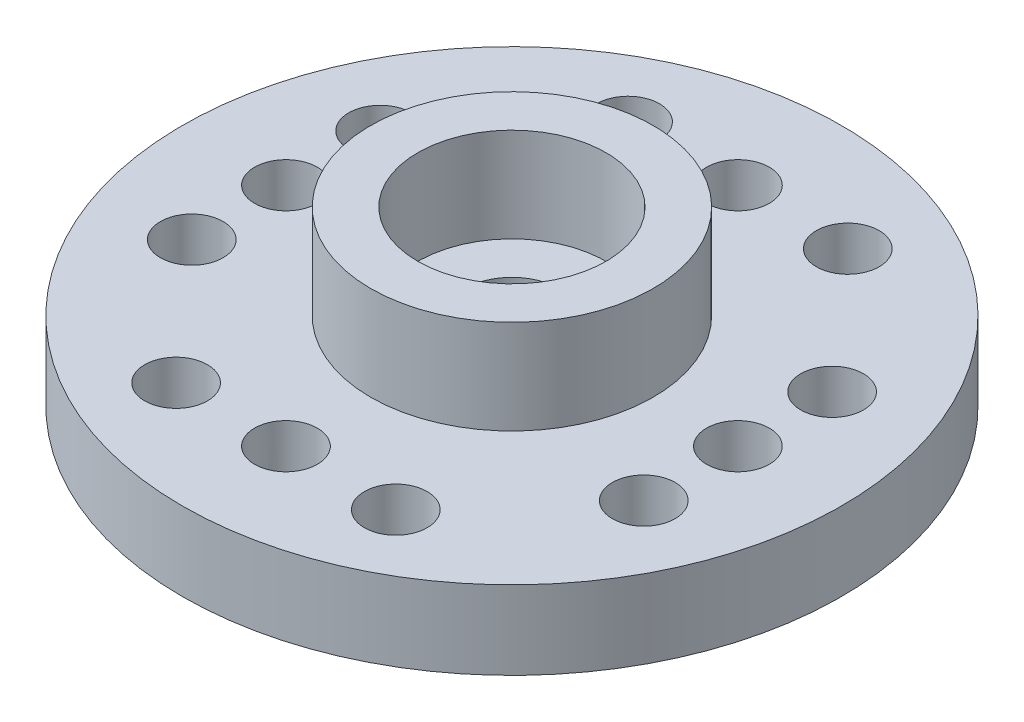
ISO-10303-21;
HEADER;
FILE_DESCRIPTION(('STEP AP214'),'2;1');
FILE_NAME('part.step','',(''),(''),'','','');
FILE_SCHEMA(('AUTOMOTIVE_DESIGN { 1 0 10303 214 1 1 1 1 }'));
ENDSEC;
DATA;
#1=APPLICATION_CONTEXT('core data for automotive mechanical design processes');
#2=APPLICATION_PROTOCOL_DEFINITION('international standard','automotive_design',2000,#1);
#3=PRODUCT_CONTEXT('',#1,'mechanical');
#4=PRODUCT('Part','Part','',(#3));
#5=PRODUCT_RELATED_PRODUCT_CATEGORY('part','',(#4));
#6=PRODUCT_DEFINITION_FORMATION('','',#4);
#7=PRODUCT_DEFINITION_CONTEXT('part definition',#1,'design');
#8=PRODUCT_DEFINITION('design','',#6,#7);
#9=PRODUCT_DEFINITION_SHAPE('','',#8);
#10=(LENGTH_UNIT() NAMED_UNIT(*) SI_UNIT(.MILLI.,.METRE.));
#11=(NAMED_UNIT(*) PLANE_ANGLE_UNIT() SI_UNIT($,.RADIAN.));
#12=(NAMED_UNIT(*) SI_UNIT($,.STERADIAN.) SOLID_ANGLE_UNIT());
#13=UNCERTAINTY_MEASURE_WITH_UNIT(LENGTH_MEASURE(1.E-05),#10,'distance_accuracy_value','');
#14=(GEOMETRIC_REPRESENTATION_CONTEXT(3) GLOBAL_UNCERTAINTY_ASSIGNED_CONTEXT((#13)) GLOBAL_UNIT_ASSIGNED_CONTEXT((#10,
#11,#12)) REPRESENTATION_CONTEXT('',''));
#15=CARTESIAN_POINT('',(0.,0.,0.));
#16=DIRECTION('',(0.,0.,1.));
#17=DIRECTION('',(1.,0.,0.));
#18=AXIS2_PLACEMENT_3D('',#15,#16,#17);
#19=CARTESIAN_POINT('',(0.,2.5,0.));
#20=DIRECTION('',(0.,-1.,0.));
#21=DIRECTION('',(0.,0.,-1.));
#22=AXIS2_PLACEMENT_3D('',#19,#20,#21);
#23=CYLINDRICAL_SURFACE('',#22,10.5);
#24=CARTESIAN_POINT('',(0.,2.5,0.));
#25=DIRECTION('',(0.,1.,0.));
#26=DIRECTION('',(0.,0.,1.));
#27=AXIS2_PLACEMENT_3D('',#24,#25,#26);
#28=CIRCLE('',#27,10.5);
#29=CARTESIAN_POINT('',(0.,2.5,10.5));
#30=VERTEX_POINT('',#29);
#31=EDGE_CURVE('E42',#30,#30,#28,.T.);
#32=ORIENTED_EDGE('',*,*,#31,.F.);
#33=EDGE_LOOP('',(#32));
#34=FACE_BOUND('',#33,.T.);
#35=CARTESIAN_POINT('',(0.,0.,0.));
#36=DIRECTION('',(0.,1.,0.));
#37=DIRECTION('',(0.,0.,1.));
#38=AXIS2_PLACEMENT_3D('',#35,#36,#37);
#39=CIRCLE('',#38,10.5);
#40=CARTESIAN_POINT('',(0.,0.,10.5));
#41=VERTEX_POINT('',#40);
#42=EDGE_CURVE('E46',#41,#41,#39,.T.);
#43=ORIENTED_EDGE('',*,*,#42,.T.);
#44=EDGE_LOOP('',(#43));
#45=FACE_BOUND('',#44,.T.);
#46=ADVANCED_FACE('F35',(#34,#45),#23,.T.);
#47=CARTESIAN_POINT('',(0.,2.5,0.));
#48=DIRECTION('',(0.,1.,0.));
#49=DIRECTION('',(0.,0.,1.));
#50=AXIS2_PLACEMENT_3D('',#47,#48,#49);
#51=PLANE('',#50);
#52=CARTESIAN_POINT('',(-3.5,2.5,7.2));
#53=DIRECTION('',(0.,1.,0.));
#54=DIRECTION('',(0.,0.,1.));
#55=AXIS2_PLACEMENT_3D('',#52,#53,#54);
#56=CIRCLE('',#55,1.);
#57=CARTESIAN_POINT('',(-3.5,2.5,8.2));
#58=VERTEX_POINT('',#57);
#59=EDGE_CURVE('E81',#58,#58,#56,.T.);
#60=ORIENTED_EDGE('',*,*,#59,.F.);
#61=EDGE_LOOP('',(#60));
#62=FACE_BOUND('',#61,.T.);
#63=CARTESIAN_POINT('',(3.5,2.5,-7.2));
#64=DIRECTION('',(0.,1.,0.));
#65=DIRECTION('',(0.,0.,1.));
#66=AXIS2_PLACEMENT_3D('',#63,#64,#65);
#67=CIRCLE('',#66,1.);
#68=CARTESIAN_POINT('',(3.5,2.5,-6.2));
#69=VERTEX_POINT('',#68);
#70=EDGE_CURVE('E84',#69,#69,#67,.T.);
#71=ORIENTED_EDGE('',*,*,#70,.F.);
#72=EDGE_LOOP('',(#71));
#73=FACE_BOUND('',#72,.T.);
#74=CARTESIAN_POINT('',(-3.5,2.5,-7.2));
#75=DIRECTION('',(0.,1.,0.));
#76=DIRECTION('',(0.,0.,1.));
#77=AXIS2_PLACEMENT_3D('',#74,#75,#76);
#78=CIRCLE('',#77,1.);
#79=CARTESIAN_POINT('',(-3.5,2.5,-6.2));
#80=VERTEX_POINT('',#79);
#81=EDGE_CURVE('E87',#80,#80,#78,.T.);
#82=ORIENTED_EDGE('',*,*,#81,.F.);
#83=EDGE_LOOP('',(#82));
#84=FACE_BOUND('',#83,.T.);
#85=CARTESIAN_POINT('',(7.2,2.5,3.));
#86=DIRECTION('',(0.,1.,0.));
#87=DIRECTION('',(0.,0.,1.));
#88=AXIS2_PLACEMENT_3D('',#85,#86,#87);
#89=CIRCLE('',#88,1.);
#90=CARTESIAN_POINT('',(7.2,2.5,4.));
#91=VERTEX_POINT('',#90);
#92=EDGE_CURVE('E90',#91,#91,#89,.T.);
#93=ORIENTED_EDGE('',*,*,#92,.F.);
#94=EDGE_LOOP('',(#93));
#95=FACE_BOUND('',#94,.T.);
#96=CARTESIAN_POINT('',(0.,2.5,-7.2));
#97=DIRECTION('',(0.,1.,0.));
#98=DIRECTION('',(0.,0.,1.));
#99=AXIS2_PLACEMENT_3D('',#96,#97,#98);
#100=CIRCLE('',#99,1.);
#101=CARTESIAN_POINT('',(0.,2.5,-6.2));
#102=VERTEX_POINT('',#101);
#103=EDGE_CURVE('E93',#102,#102,#100,.T.);
#104=ORIENTED_EDGE('',*,*,#103,.F.);
#105=EDGE_LOOP('',(#104));
#106=FACE_BOUND('',#105,.T.);
#107=CARTESIAN_POINT('',(7.2,2.5,0.));
#108=DIRECTION('',(0.,1.,0.));
#109=DIRECTION('',(0.,0.,1.));
#110=AXIS2_PLACEMENT_3D('',#107,#108,#109);
#111=CIRCLE('',#110,1.);
#112=CARTESIAN_POINT('',(7.2,2.5,1.));
#113=VERTEX_POINT('',#112);
#114=EDGE_CURVE('E96',#113,#113,#111,.T.);
#115=ORIENTED_EDGE('',*,*,#114,.F.);
#116=EDGE_LOOP('',(#115));
#117=FACE_BOUND('',#116,.T.);
#118=CARTESIAN_POINT('',(-7.2,2.5,0.));
#119=DIRECTION('',(0.,1.,0.));
#120=DIRECTION('',(0.,0.,1.));
#121=AXIS2_PLACEMENT_3D('',#118,#119,#120);
#122=CIRCLE('',#121,1.);
#123=CARTESIAN_POINT('',(-7.2,2.5,1.));
#124=VERTEX_POINT('',#123);
#125=EDGE_CURVE('E99',#124,#124,#122,.T.);
#126=ORIENTED_EDGE('',*,*,#125,.F.);
#127=EDGE_LOOP('',(#126));
#128=FACE_BOUND('',#127,.T.);
#129=CARTESIAN_POINT('',(3.5,2.5,7.2));
#130=DIRECTION('',(0.,1.,0.));
#131=DIRECTION('',(0.,0.,1.));
#132=AXIS2_PLACEMENT_3D('',#129,#130,#131);
#133=CIRCLE('',#132,1.);
#134=CARTESIAN_POINT('',(3.5,2.5,8.2));
#135=VERTEX_POINT('',#134);
#136=EDGE_CURVE('E102',#135,#135,#133,.T.);
#137=ORIENTED_EDGE('',*,*,#136,.F.);
#138=EDGE_LOOP('',(#137));
#139=FACE_BOUND('',#138,.T.);
#140=CARTESIAN_POINT('',(7.2,2.5,-3.));
#141=DIRECTION('',(0.,1.,0.));
#142=DIRECTION('',(0.,0.,1.));
#143=AXIS2_PLACEMENT_3D('',#140,#141,#142);
#144=CIRCLE('',#143,1.);
#145=CARTESIAN_POINT('',(7.2,2.5,-2.));
#146=VERTEX_POINT('',#145);
#147=EDGE_CURVE('E105',#146,#146,#144,.T.);
#148=ORIENTED_EDGE('',*,*,#147,.F.);
#149=EDGE_LOOP('',(#148));
#150=FACE_BOUND('',#149,.T.);
#151=CARTESIAN_POINT('',(-7.2,2.5,-3.));
#152=DIRECTION('',(0.,1.,0.));
#153=DIRECTION('',(0.,0.,1.));
#154=AXIS2_PLACEMENT_3D('',#151,#152,#153);
#155=CIRCLE('',#154,1.);
#156=CARTESIAN_POINT('',(-7.2,2.5,-2.));
#157=VERTEX_POINT('',#156);
#158=EDGE_CURVE('E108',#157,#157,#155,.T.);
#159=ORIENTED_EDGE('',*,*,#158,.F.);
#160=EDGE_LOOP('',(#159));
#161=FACE_BOUND('',#160,.T.);
#162=CARTESIAN_POINT('',(-7.2,2.5,3.));
#163=DIRECTION('',(0.,1.,0.));
#164=DIRECTION('',(0.,0.,1.));
#165=AXIS2_PLACEMENT_3D('',#162,#163,#164);
#166=CIRCLE('',#165,1.);
#167=CARTESIAN_POINT('',(-7.2,2.5,4.));
#168=VERTEX_POINT('',#167);
#169=EDGE_CURVE('E111',#168,#168,#166,.T.);
#170=ORIENTED_EDGE('',*,*,#169,.F.);
#171=EDGE_LOOP('',(#170));
#172=FACE_BOUND('',#171,.T.);
#173=CARTESIAN_POINT('',(0.,2.5,7.2));
#174=DIRECTION('',(0.,1.,0.));
#175=DIRECTION('',(0.,0.,1.));
#176=AXIS2_PLACEMENT_3D('',#173,#174,#175);
#177=CIRCLE('',#176,1.);
#178=CARTESIAN_POINT('',(0.,2.5,8.2));
#179=VERTEX_POINT('',#178);
#180=EDGE_CURVE('E114',#179,#179,#177,.T.);
#181=ORIENTED_EDGE('',*,*,#180,.F.);
#182=EDGE_LOOP('',(#181));
#183=FACE_BOUND('',#182,.T.);
#184=CARTESIAN_POINT('',(0.,2.5,0.));
#185=DIRECTION('',(0.,1.,0.));
#186=DIRECTION('',(0.,0.,1.));
#187=AXIS2_PLACEMENT_3D('',#184,#185,#186);
#188=CIRCLE('',#187,4.5);
#189=CARTESIAN_POINT('',(0.,2.5,4.5));
#190=VERTEX_POINT('',#189);
#191=EDGE_CURVE('E52',#190,#190,#188,.T.);
#192=ORIENTED_EDGE('',*,*,#191,.F.);
#193=EDGE_LOOP('',(#192));
#194=FACE_BOUND('',#193,.T.);
#195=ORIENTED_EDGE('',*,*,#31,.T.);
#196=EDGE_LOOP('',(#195));
#197=FACE_BOUND('',#196,.T.);
#198=ADVANCED_FACE('F160',(#62,#73,#84,#95,#106,#117,#128,#139,#150,#161,#172,#183,#194,#197),
#51,.T.);
#199=CARTESIAN_POINT('',(0.,0.,0.));
#200=DIRECTION('',(0.,1.,0.));
#201=DIRECTION('',(0.,0.,1.));
#202=AXIS2_PLACEMENT_3D('',#199,#200,#201);
#203=PLANE('',#202);
#204=CARTESIAN_POINT('',(-3.5,0.,7.2));
#205=DIRECTION('',(0.,-1.,0.));
#206=DIRECTION('',(0.,0.,-1.));
#207=AXIS2_PLACEMENT_3D('',#204,#205,#206);
#208=CIRCLE('',#207,1.);
#209=CARTESIAN_POINT('',(-3.5,0.,6.2));
#210=VERTEX_POINT('',#209);
#211=EDGE_CURVE('E130',#210,#210,#208,.T.);
#212=ORIENTED_EDGE('',*,*,#211,.F.);
#213=EDGE_LOOP('',(#212));
#214=FACE_BOUND('',#213,.T.);
#215=CARTESIAN_POINT('',(3.5,0.,-7.2));
#216=DIRECTION('',(0.,-1.,0.));
#217=DIRECTION('',(0.,0.,1.));
#218=AXIS2_PLACEMENT_3D('',#215,#216,#217);
#219=CIRCLE('',#218,1.);
#220=CARTESIAN_POINT('',(3.5,0.,-6.2));
#221=VERTEX_POINT('',#220);
#222=EDGE_CURVE('E133',#221,#221,#219,.T.);
#223=ORIENTED_EDGE('',*,*,#222,.F.);
#224=EDGE_LOOP('',(#223));
#225=FACE_BOUND('',#224,.T.);
#226=CARTESIAN_POINT('',(-3.5,0.,-7.2));
#227=DIRECTION('',(0.,-1.,0.));
#228=DIRECTION('',(0.,0.,1.));
#229=AXIS2_PLACEMENT_3D('',#226,#227,#228);
#230=CIRCLE('',#229,1.);
#231=CARTESIAN_POINT('',(-3.5,0.,-6.2));
#232=VERTEX_POINT('',#231);
#233=EDGE_CURVE('E136',#232,#232,#230,.T.);
#234=ORIENTED_EDGE('',*,*,#233,.F.);
#235=EDGE_LOOP('',(#234));
#236=FACE_BOUND('',#235,.T.);
#237=CARTESIAN_POINT('',(7.2,0.,3.));
#238=DIRECTION('',(0.,-1.,0.));
#239=DIRECTION('',(0.,0.,-1.));
#240=AXIS2_PLACEMENT_3D('',#237,#238,#239);
#241=CIRCLE('',#240,1.);
#242=CARTESIAN_POINT('',(7.2,0.,2.));
#243=VERTEX_POINT('',#242);
#244=EDGE_CURVE('E139',#243,#243,#241,.T.);
#245=ORIENTED_EDGE('',*,*,#244,.F.);
#246=EDGE_LOOP('',(#245));
#247=FACE_BOUND('',#246,.T.);
#248=CARTESIAN_POINT('',(0.,0.,-7.2));
#249=DIRECTION('',(0.,-1.,0.));
#250=DIRECTION('',(0.,0.,1.));
#251=AXIS2_PLACEMENT_3D('',#248,#249,#250);
#252=CIRCLE('',#251,1.);
#253=CARTESIAN_POINT('',(0.,0.,-6.2));
#254=VERTEX_POINT('',#253);
#255=EDGE_CURVE('E120',#254,#254,#252,.T.);
#256=ORIENTED_EDGE('',*,*,#255,.F.);
#257=EDGE_LOOP('',(#256));
#258=FACE_BOUND('',#257,.T.);
#259=CARTESIAN_POINT('',(7.2,0.,0.));
#260=DIRECTION('',(0.,-1.,0.));
#261=DIRECTION('',(0.,0.,-1.));
#262=AXIS2_PLACEMENT_3D('',#259,#260,#261);
#263=CIRCLE('',#262,1.);
#264=CARTESIAN_POINT('',(7.2,0.,-1.));
#265=VERTEX_POINT('',#264);
#266=EDGE_CURVE('E121',#265,#265,#263,.T.);
#267=ORIENTED_EDGE('',*,*,#266,.F.);
#268=EDGE_LOOP('',(#267));
#269=FACE_BOUND('',#268,.T.);
#270=CARTESIAN_POINT('',(-7.2,0.,0.));
#271=DIRECTION('',(0.,-1.,0.));
#272=DIRECTION('',(0.,0.,1.));
#273=AXIS2_PLACEMENT_3D('',#270,#271,#272);
#274=CIRCLE('',#273,1.);
#275=CARTESIAN_POINT('',(-7.2,0.,1.));
#276=VERTEX_POINT('',#275);
#277=EDGE_CURVE('E124',#276,#276,#274,.T.);
#278=ORIENTED_EDGE('',*,*,#277,.F.);
#279=EDGE_LOOP('',(#278));
#280=FACE_BOUND('',#279,.T.);
#281=CARTESIAN_POINT('',(3.5,0.,7.2));
#282=DIRECTION('',(0.,-1.,0.));
#283=DIRECTION('',(0.,0.,-1.));
#284=AXIS2_PLACEMENT_3D('',#281,#282,#283);
#285=CIRCLE('',#284,1.);
#286=CARTESIAN_POINT('',(3.5,0.,6.2));
#287=VERTEX_POINT('',#286);
#288=EDGE_CURVE('E127',#287,#287,#285,.T.);
#289=ORIENTED_EDGE('',*,*,#288,.F.);
#290=EDGE_LOOP('',(#289));
#291=FACE_BOUND('',#290,.T.);
#292=CARTESIAN_POINT('',(7.2,0.,-3.));
#293=DIRECTION('',(0.,-1.,0.));
#294=DIRECTION('',(0.,0.,-1.));
#295=AXIS2_PLACEMENT_3D('',#292,#293,#294);
#296=CIRCLE('',#295,1.);
#297=CARTESIAN_POINT('',(7.2,0.,-4.));
#298=VERTEX_POINT('',#297);
#299=EDGE_CURVE('E142',#298,#298,#296,.T.);
#300=ORIENTED_EDGE('',*,*,#299,.F.);
#301=EDGE_LOOP('',(#300));
#302=FACE_BOUND('',#301,.T.);
#303=CARTESIAN_POINT('',(-7.2,0.,-3.));
#304=DIRECTION('',(0.,-1.,0.));
#305=DIRECTION('',(0.,0.,1.));
#306=AXIS2_PLACEMENT_3D('',#303,#304,#305);
#307=CIRCLE('',#306,1.);
#308=CARTESIAN_POINT('',(-7.2,0.,-2.));
#309=VERTEX_POINT('',#308);
#310=EDGE_CURVE('E148',#309,#309,#307,.T.);
#311=ORIENTED_EDGE('',*,*,#310,.F.);
#312=EDGE_LOOP('',(#311));
#313=FACE_BOUND('',#312,.T.);
#314=CARTESIAN_POINT('',(-7.2,0.,3.));
#315=DIRECTION('',(0.,-1.,0.));
#316=DIRECTION('',(0.,0.,1.));
#317=AXIS2_PLACEMENT_3D('',#314,#315,#316);
#318=CIRCLE('',#317,1.);
#319=CARTESIAN_POINT('',(-7.2,0.,4.));
#320=VERTEX_POINT('',#319);
#321=EDGE_CURVE('E145',#320,#320,#318,.T.);
#322=ORIENTED_EDGE('',*,*,#321,.F.);
#323=EDGE_LOOP('',(#322));
#324=FACE_BOUND('',#323,.T.);
#325=CARTESIAN_POINT('',(0.,0.,7.2));
#326=DIRECTION('',(0.,-1.,0.));
#327=DIRECTION('',(0.,0.,-1.));
#328=AXIS2_PLACEMENT_3D('',#325,#326,#327);
#329=CIRCLE('',#328,1.);
#330=CARTESIAN_POINT('',(0.,0.,6.2));
#331=VERTEX_POINT('',#330);
#332=EDGE_CURVE('E117',#331,#331,#329,.T.);
#333=ORIENTED_EDGE('',*,*,#332,.F.);
#334=EDGE_LOOP('',(#333));
#335=FACE_BOUND('',#334,.T.);
#336=CARTESIAN_POINT('',(0.,0.,0.));
#337=DIRECTION('',(0.,-1.,0.));
#338=DIRECTION('',(0.,0.,-1.));
#339=AXIS2_PLACEMENT_3D('',#336,#337,#338);
#340=CIRCLE('',#339,4.75);
#341=CARTESIAN_POINT('',(0.,0.,-4.75));
#342=VERTEX_POINT('',#341);
#343=EDGE_CURVE('E61',#342,#342,#340,.T.);
#344=ORIENTED_EDGE('',*,*,#343,.F.);
#345=EDGE_LOOP('',(#344));
#346=FACE_BOUND('',#345,.T.);
#347=ORIENTED_EDGE('',*,*,#42,.F.);
#348=EDGE_LOOP('',(#347));
#349=FACE_BOUND('',#348,.T.);
#350=ADVANCED_FACE('F156',(#214,#225,#236,#247,#258,#269,#280,#291,#302,#313,#324,#335,#346,
#349),#203,.F.);
#351=CARTESIAN_POINT('',(0.,5.5,0.));
#352=DIRECTION('',(0.,1.,0.));
#353=DIRECTION('',(0.,0.,1.));
#354=AXIS2_PLACEMENT_3D('',#351,#352,#353);
#355=PLANE('',#354);
#356=CARTESIAN_POINT('',(0.,5.5,0.));
#357=DIRECTION('',(0.,1.,0.));
#358=DIRECTION('',(0.,0.,1.));
#359=AXIS2_PLACEMENT_3D('',#356,#357,#358);
#360=CIRCLE('',#359,4.5);
#361=CARTESIAN_POINT('',(0.,5.5,4.5));
#362=VERTEX_POINT('',#361);
#363=EDGE_CURVE('E50',#362,#362,#360,.T.);
#364=ORIENTED_EDGE('',*,*,#363,.T.);
#365=EDGE_LOOP('',(#364));
#366=FACE_BOUND('',#365,.T.);
#367=CARTESIAN_POINT('',(0.,5.5,0.));
#368=DIRECTION('',(0.,1.,0.));
#369=DIRECTION('',(0.,0.,1.));
#370=AXIS2_PLACEMENT_3D('',#367,#368,#369);
#371=CIRCLE('',#370,3.);
#372=CARTESIAN_POINT('',(0.,5.5,3.));
#373=VERTEX_POINT('',#372);
#374=EDGE_CURVE('E55',#373,#373,#371,.T.);
#375=ORIENTED_EDGE('',*,*,#374,.F.);
#376=EDGE_LOOP('',(#375));
#377=FACE_BOUND('',#376,.T.);
#378=ADVANCED_FACE('F159',(#366,#377),#355,.T.);
#379=CARTESIAN_POINT('',(0.,5.5,0.));
#380=DIRECTION('',(0.,-1.,0.));
#381=DIRECTION('',(0.,0.,-1.));
#382=AXIS2_PLACEMENT_3D('',#379,#380,#381);
#383=CYLINDRICAL_SURFACE('',#382,4.5);
#384=ORIENTED_EDGE('',*,*,#363,.F.);
#385=EDGE_LOOP('',(#384));
#386=FACE_BOUND('',#385,.T.);
#387=ORIENTED_EDGE('',*,*,#191,.T.);
#388=EDGE_LOOP('',(#387));
#389=FACE_BOUND('',#388,.T.);
#390=ADVANCED_FACE('F203',(#386,#389),#383,.T.);
#391=CARTESIAN_POINT('',(0.,5.5,0.));
#392=DIRECTION('',(0.,-1.,0.));
#393=DIRECTION('',(0.,0.,-1.));
#394=AXIS2_PLACEMENT_3D('',#391,#392,#393);
#395=CYLINDRICAL_SURFACE('',#394,3.);
#396=ORIENTED_EDGE('',*,*,#374,.T.);
#397=EDGE_LOOP('',(#396));
#398=FACE_BOUND('',#397,.T.);
#399=CARTESIAN_POINT('',(0.,2.5,0.));
#400=DIRECTION('',(0.,1.,0.));
#401=DIRECTION('',(0.,0.,1.));
#402=AXIS2_PLACEMENT_3D('',#399,#400,#401);
#403=CIRCLE('',#402,3.);
#404=CARTESIAN_POINT('',(0.,2.5,3.));
#405=VERTEX_POINT('',#404);
#406=EDGE_CURVE('E10',#405,#405,#403,.F.);
#407=ORIENTED_EDGE('',*,*,#406,.T.);
#408=EDGE_LOOP('',(#407));
#409=FACE_BOUND('',#408,.T.);
#410=ADVANCED_FACE('F192',(#398,#409),#395,.F.);
#411=CARTESIAN_POINT('',(0.,2.5,0.));
#412=DIRECTION('',(0.,1.,0.));
#413=DIRECTION('',(0.,0.,1.));
#414=AXIS2_PLACEMENT_3D('',#411,#412,#413);
#415=CIRCLE('',#414,1.5);
#416=CARTESIAN_POINT('',(0.,2.5,1.5));
#417=VERTEX_POINT('',#416);
#418=EDGE_CURVE('E38',#417,#417,#415,.T.);
#419=ORIENTED_EDGE('',*,*,#418,.F.);
#420=EDGE_LOOP('',(#419));
#421=FACE_BOUND('',#420,.T.);
#422=ORIENTED_EDGE('',*,*,#406,.F.);
#423=EDGE_LOOP('',(#422));
#424=FACE_BOUND('',#423,.T.);
#425=ADVANCED_FACE('F181',(#421,#424),#51,.T.);
#426=CARTESIAN_POINT('',(0.,1.,0.));
#427=DIRECTION('',(0.,-1.,0.));
#428=DIRECTION('',(0.,0.,-1.));
#429=AXIS2_PLACEMENT_3D('',#426,#427,#428);
#430=CYLINDRICAL_SURFACE('',#429,4.75);
#431=CARTESIAN_POINT('',(0.,1.,0.));
#432=DIRECTION('',(0.,-1.,0.));
#433=DIRECTION('',(0.,0.,-1.));
#434=AXIS2_PLACEMENT_3D('',#431,#432,#433);
#435=CIRCLE('',#434,4.75);
#436=CARTESIAN_POINT('',(0.,1.,-4.75));
#437=VERTEX_POINT('',#436);
#438=EDGE_CURVE('E60',#437,#437,#435,.T.);
#439=ORIENTED_EDGE('',*,*,#438,.F.);
#440=EDGE_LOOP('',(#439));
#441=FACE_BOUND('',#440,.T.);
#442=ORIENTED_EDGE('',*,*,#343,.T.);
#443=EDGE_LOOP('',(#442));
#444=FACE_BOUND('',#443,.T.);
#445=ADVANCED_FACE('F191',(#441,#444),#430,.F.);
#446=CARTESIAN_POINT('',(0.,1.,0.));
#447=DIRECTION('',(0.,-1.,0.));
#448=DIRECTION('',(0.,0.,-1.));
#449=AXIS2_PLACEMENT_3D('',#446,#447,#448);
#450=PLANE('',#449);
#451=CARTESIAN_POINT('',(0.,1.,0.));
#452=DIRECTION('',(0.,-1.,0.));
#453=DIRECTION('',(0.,0.,-1.));
#454=AXIS2_PLACEMENT_3D('',#451,#452,#453);
#455=CIRCLE('',#454,3.25);
#456=CARTESIAN_POINT('',(0.,1.,-3.25));
#457=VERTEX_POINT('',#456);
#458=EDGE_CURVE('E64',#457,#457,#455,.T.);
#459=ORIENTED_EDGE('',*,*,#458,.F.);
#460=EDGE_LOOP('',(#459));
#461=FACE_BOUND('',#460,.T.);
#462=ORIENTED_EDGE('',*,*,#438,.T.);
#463=EDGE_LOOP('',(#462));
#464=FACE_BOUND('',#463,.T.);
#465=ADVANCED_FACE('F199',(#461,#464),#450,.T.);
#466=CARTESIAN_POINT('',(0.,1.,0.));
#467=DIRECTION('',(0.,-1.,0.));
#468=DIRECTION('',(0.,0.,-1.));
#469=AXIS2_PLACEMENT_3D('',#466,#467,#468);
#470=CYLINDRICAL_SURFACE('',#469,3.25);
#471=ORIENTED_EDGE('',*,*,#458,.T.);
#472=EDGE_LOOP('',(#471));
#473=FACE_BOUND('',#472,.T.);
#474=CARTESIAN_POINT('',(0.,0.,0.));
#475=DIRECTION('',(0.,-1.,0.));
#476=DIRECTION('',(0.,0.,-1.));
#477=AXIS2_PLACEMENT_3D('',#474,#475,#476);
#478=CIRCLE('',#477,3.25);
#479=CARTESIAN_POINT('',(0.,0.,-3.25));
#480=VERTEX_POINT('',#479);
#481=EDGE_CURVE('E67',#480,#480,#478,.T.);
#482=ORIENTED_EDGE('',*,*,#481,.F.);
#483=EDGE_LOOP('',(#482));
#484=FACE_BOUND('',#483,.T.);
#485=ADVANCED_FACE('F228',(#473,#484),#470,.T.);
#486=CARTESIAN_POINT('',(0.,0.,0.));
#487=DIRECTION('',(0.,-1.,0.));
#488=DIRECTION('',(0.,0.,-1.));
#489=AXIS2_PLACEMENT_3D('',#486,#487,#488);
#490=CIRCLE('',#489,3.);
#491=CARTESIAN_POINT('',(0.,0.,-3.));
#492=VERTEX_POINT('',#491);
#493=EDGE_CURVE('E73',#492,#492,#490,.T.);
#494=ORIENTED_EDGE('',*,*,#493,.F.);
#495=EDGE_LOOP('',(#494));
#496=FACE_BOUND('',#495,.T.);
#497=ORIENTED_EDGE('',*,*,#481,.T.);
#498=EDGE_LOOP('',(#497));
#499=FACE_BOUND('',#498,.T.);
#500=ADVANCED_FACE('F162',(#496,#499),#203,.F.);
#501=CARTESIAN_POINT('',(0.,1.,0.));
#502=DIRECTION('',(0.,-1.,0.));
#503=DIRECTION('',(0.,0.,-1.));
#504=AXIS2_PLACEMENT_3D('',#501,#502,#503);
#505=CYLINDRICAL_SURFACE('',#504,3.);
#506=CARTESIAN_POINT('',(0.,1.,0.));
#507=DIRECTION('',(0.,-1.,0.));
#508=DIRECTION('',(0.,0.,-1.));
#509=AXIS2_PLACEMENT_3D('',#506,#507,#508);
#510=CIRCLE('',#509,3.);
#511=CARTESIAN_POINT('',(0.,1.,-3.));
#512=VERTEX_POINT('',#511);
#513=EDGE_CURVE('E70',#512,#512,#510,.T.);
#514=ORIENTED_EDGE('',*,*,#513,.F.);
#515=EDGE_LOOP('',(#514));
#516=FACE_BOUND('',#515,.T.);
#517=ORIENTED_EDGE('',*,*,#493,.T.);
#518=EDGE_LOOP('',(#517));
#519=FACE_BOUND('',#518,.T.);
#520=ADVANCED_FACE('F218',(#516,#519),#505,.F.);
#521=CARTESIAN_POINT('',(0.,1.,0.));
#522=DIRECTION('',(0.,-1.,0.));
#523=DIRECTION('',(0.,0.,-1.));
#524=AXIS2_PLACEMENT_3D('',#521,#522,#523);
#525=PLANE('',#524);
#526=CARTESIAN_POINT('',(0.,1.,0.));
#527=DIRECTION('',(0.,-1.,0.));
#528=DIRECTION('',(0.,0.,-1.));
#529=AXIS2_PLACEMENT_3D('',#526,#527,#528);
#530=CIRCLE('',#529,1.5);
#531=CARTESIAN_POINT('',(0.,1.,-1.5));
#532=VERTEX_POINT('',#531);
#533=EDGE_CURVE('E78',#532,#532,#530,.T.);
#534=ORIENTED_EDGE('',*,*,#533,.F.);
#535=EDGE_LOOP('',(#534));
#536=FACE_BOUND('',#535,.T.);
#537=ORIENTED_EDGE('',*,*,#513,.T.);
#538=EDGE_LOOP('',(#537));
#539=FACE_BOUND('',#538,.T.);
#540=ADVANCED_FACE('F213',(#536,#539),#525,.T.);
#541=CARTESIAN_POINT('',(0.,4.,0.));
#542=DIRECTION('',(0.,-1.,0.));
#543=DIRECTION('',(0.,0.,-1.));
#544=AXIS2_PLACEMENT_3D('',#541,#542,#543);
#545=CYLINDRICAL_SURFACE('',#544,1.5);
#546=ORIENTED_EDGE('',*,*,#418,.T.);
#547=EDGE_LOOP('',(#546));
#548=FACE_BOUND('',#547,.T.);
#549=ORIENTED_EDGE('',*,*,#533,.T.);
#550=EDGE_LOOP('',(#549));
#551=FACE_BOUND('',#550,.T.);
#552=ADVANCED_FACE('F210',(#548,#551),#545,.F.);
#553=CARTESIAN_POINT('',(0.,3.,7.2));
#554=DIRECTION('',(0.,-1.,0.));
#555=DIRECTION('',(0.,0.,-1.));
#556=AXIS2_PLACEMENT_3D('',#553,#554,#555);
#557=CYLINDRICAL_SURFACE('',#556,1.);
#558=ORIENTED_EDGE('',*,*,#180,.T.);
#559=EDGE_LOOP('',(#558));
#560=FACE_BOUND('',#559,.T.);
#561=ORIENTED_EDGE('',*,*,#332,.T.);
#562=EDGE_LOOP('',(#561));
#563=FACE_BOUND('',#562,.T.);
#564=ADVANCED_FACE('F212',(#560,#563),#557,.F.);
#565=CARTESIAN_POINT('',(-7.2,3.,3.));
#566=DIRECTION('',(0.,-1.,0.));
#567=DIRECTION('',(0.,0.,-1.));
#568=AXIS2_PLACEMENT_3D('',#565,#566,#567);
#569=CYLINDRICAL_SURFACE('',#568,1.);
#570=ORIENTED_EDGE('',*,*,#169,.T.);
#571=EDGE_LOOP('',(#570));
#572=FACE_BOUND('',#571,.T.);
#573=ORIENTED_EDGE('',*,*,#321,.T.);
#574=EDGE_LOOP('',(#573));
#575=FACE_BOUND('',#574,.T.);
#576=ADVANCED_FACE('F287',(#572,#575),#569,.F.);
#577=CARTESIAN_POINT('',(-7.2,3.,-3.));
#578=DIRECTION('',(0.,-1.,0.));
#579=DIRECTION('',(0.,0.,-1.));
#580=AXIS2_PLACEMENT_3D('',#577,#578,#579);
#581=CYLINDRICAL_SURFACE('',#580,1.);
#582=ORIENTED_EDGE('',*,*,#158,.T.);
#583=EDGE_LOOP('',(#582));
#584=FACE_BOUND('',#583,.T.);
#585=ORIENTED_EDGE('',*,*,#310,.T.);
#586=EDGE_LOOP('',(#585));
#587=FACE_BOUND('',#586,.T.);
#588=ADVANCED_FACE('F295',(#584,#587),#581,.F.);
#589=CARTESIAN_POINT('',(7.2,3.,-3.));
#590=DIRECTION('',(0.,-1.,0.));
#591=DIRECTION('',(0.,0.,-1.));
#592=AXIS2_PLACEMENT_3D('',#589,#590,#591);
#593=CYLINDRICAL_SURFACE('',#592,1.);
#594=ORIENTED_EDGE('',*,*,#147,.T.);
#595=EDGE_LOOP('',(#594));
#596=FACE_BOUND('',#595,.T.);
#597=ORIENTED_EDGE('',*,*,#299,.T.);
#598=EDGE_LOOP('',(#597));
#599=FACE_BOUND('',#598,.T.);
#600=ADVANCED_FACE('F154',(#596,#599),#593,.F.);
#601=CARTESIAN_POINT('',(3.5,3.,7.2));
#602=DIRECTION('',(0.,-1.,0.));
#603=DIRECTION('',(0.,0.,-1.));
#604=AXIS2_PLACEMENT_3D('',#601,#602,#603);
#605=CYLINDRICAL_SURFACE('',#604,1.);
#606=ORIENTED_EDGE('',*,*,#136,.T.);
#607=EDGE_LOOP('',(#606));
#608=FACE_BOUND('',#607,.T.);
#609=ORIENTED_EDGE('',*,*,#288,.T.);
#610=EDGE_LOOP('',(#609));
#611=FACE_BOUND('',#610,.T.);
#612=ADVANCED_FACE('F310',(#608,#611),#605,.F.);
#613=CARTESIAN_POINT('',(-7.2,3.,0.));
#614=DIRECTION('',(0.,-1.,0.));
#615=DIRECTION('',(0.,0.,-1.));
#616=AXIS2_PLACEMENT_3D('',#613,#614,#615);
#617=CYLINDRICAL_SURFACE('',#616,1.);
#618=ORIENTED_EDGE('',*,*,#125,.T.);
#619=EDGE_LOOP('',(#618));
#620=FACE_BOUND('',#619,.T.);
#621=ORIENTED_EDGE('',*,*,#277,.T.);
#622=EDGE_LOOP('',(#621));
#623=FACE_BOUND('',#622,.T.);
#624=ADVANCED_FACE('F318',(#620,#623),#617,.F.);
#625=CARTESIAN_POINT('',(7.2,3.,0.));
#626=DIRECTION('',(0.,-1.,0.));
#627=DIRECTION('',(0.,0.,-1.));
#628=AXIS2_PLACEMENT_3D('',#625,#626,#627);
#629=CYLINDRICAL_SURFACE('',#628,1.);
#630=ORIENTED_EDGE('',*,*,#114,.T.);
#631=EDGE_LOOP('',(#630));
#632=FACE_BOUND('',#631,.T.);
#633=ORIENTED_EDGE('',*,*,#266,.T.);
#634=EDGE_LOOP('',(#633));
#635=FACE_BOUND('',#634,.T.);
#636=ADVANCED_FACE('F326',(#632,#635),#629,.F.);
#637=CARTESIAN_POINT('',(0.,3.,-7.2));
#638=DIRECTION('',(0.,-1.,0.));
#639=DIRECTION('',(0.,0.,-1.));
#640=AXIS2_PLACEMENT_3D('',#637,#638,#639);
#641=CYLINDRICAL_SURFACE('',#640,1.);
#642=ORIENTED_EDGE('',*,*,#103,.T.);
#643=EDGE_LOOP('',(#642));
#644=FACE_BOUND('',#643,.T.);
#645=ORIENTED_EDGE('',*,*,#255,.T.);
#646=EDGE_LOOP('',(#645));
#647=FACE_BOUND('',#646,.T.);
#648=ADVANCED_FACE('F334',(#644,#647),#641,.F.);
#649=CARTESIAN_POINT('',(7.2,3.,3.));
#650=DIRECTION('',(0.,-1.,0.));
#651=DIRECTION('',(0.,0.,-1.));
#652=AXIS2_PLACEMENT_3D('',#649,#650,#651);
#653=CYLINDRICAL_SURFACE('',#652,1.);
#654=ORIENTED_EDGE('',*,*,#92,.T.);
#655=EDGE_LOOP('',(#654));
#656=FACE_BOUND('',#655,.T.);
#657=ORIENTED_EDGE('',*,*,#244,.T.);
#658=EDGE_LOOP('',(#657));
#659=FACE_BOUND('',#658,.T.);
#660=ADVANCED_FACE('F342',(#656,#659),#653,.F.);
#661=CARTESIAN_POINT('',(-3.5,3.,-7.2));
#662=DIRECTION('',(0.,-1.,0.));
#663=DIRECTION('',(0.,0.,-1.));
#664=AXIS2_PLACEMENT_3D('',#661,#662,#663);
#665=CYLINDRICAL_SURFACE('',#664,1.);
#666=ORIENTED_EDGE('',*,*,#81,.T.);
#667=EDGE_LOOP('',(#666));
#668=FACE_BOUND('',#667,.T.);
#669=ORIENTED_EDGE('',*,*,#233,.T.);
#670=EDGE_LOOP('',(#669));
#671=FACE_BOUND('',#670,.T.);
#672=ADVANCED_FACE('F350',(#668,#671),#665,.F.);
#673=CARTESIAN_POINT('',(3.5,3.,-7.2));
#674=DIRECTION('',(0.,-1.,0.));
#675=DIRECTION('',(0.,0.,-1.));
#676=AXIS2_PLACEMENT_3D('',#673,#674,#675);
#677=CYLINDRICAL_SURFACE('',#676,1.);
#678=ORIENTED_EDGE('',*,*,#70,.T.);
#679=EDGE_LOOP('',(#678));
#680=FACE_BOUND('',#679,.T.);
#681=ORIENTED_EDGE('',*,*,#222,.T.);
#682=EDGE_LOOP('',(#681));
#683=FACE_BOUND('',#682,.T.);
#684=ADVANCED_FACE('F358',(#680,#683),#677,.F.);
#685=CARTESIAN_POINT('',(-3.5,3.,7.2));
#686=DIRECTION('',(0.,-1.,0.));
#687=DIRECTION('',(0.,0.,-1.));
#688=AXIS2_PLACEMENT_3D('',#685,#686,#687);
#689=CYLINDRICAL_SURFACE('',#688,1.);
#690=ORIENTED_EDGE('',*,*,#59,.T.);
#691=EDGE_LOOP('',(#690));
#692=FACE_BOUND('',#691,.T.);
#693=ORIENTED_EDGE('',*,*,#211,.T.);
#694=EDGE_LOOP('',(#693));
#695=FACE_BOUND('',#694,.T.);
#696=ADVANCED_FACE('F366',(#692,#695),#689,.F.);
#697=CLOSED_SHELL('',(#46,#198,#350,#378,#390,#410,#425,#445,#465,#485,#500,#520,#540,#552,#564,
#576,#588,#600,#612,#624,#636,#648,#660,#672,#684,#696));
#698=MANIFOLD_SOLID_BREP('B2',#697);
#699=ADVANCED_BREP_SHAPE_REPRESENTATION('',(#18,#698),#14);
#700=SHAPE_DEFINITION_REPRESENTATION(#9,#699);
ENDSEC;
END-ISO-10303-21;
